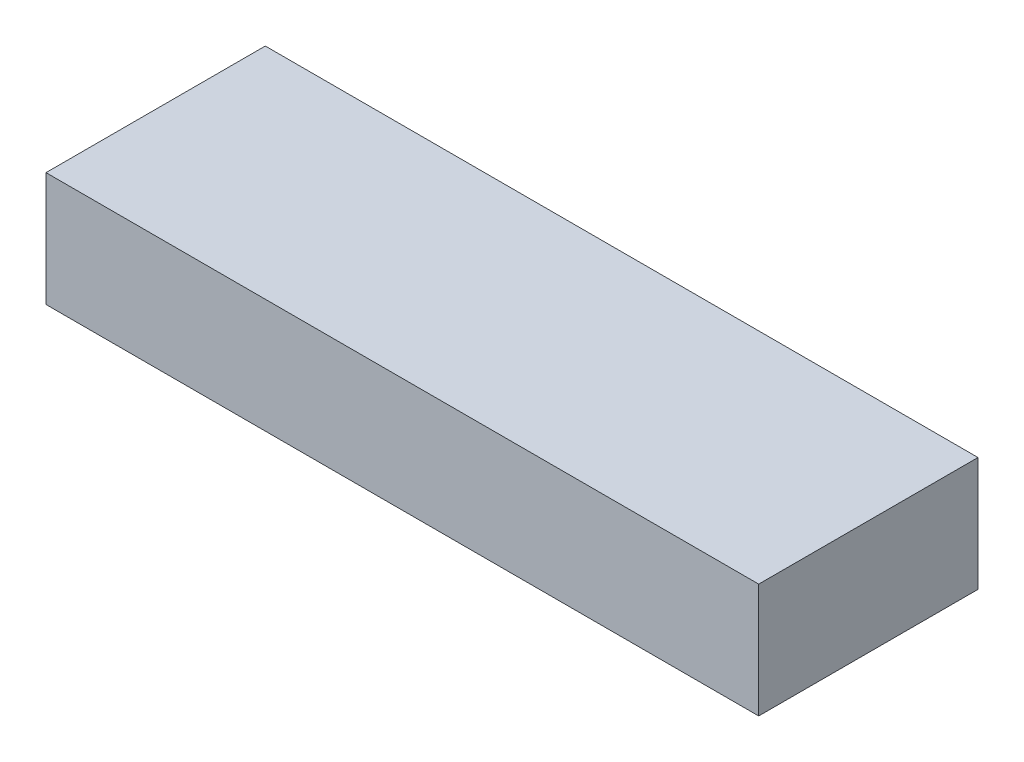
ISO-10303-21;
HEADER;
FILE_DESCRIPTION(('STEP AP214'),'2;1');
FILE_NAME('part.step','',(''),(''),'','','');
FILE_SCHEMA(('AUTOMOTIVE_DESIGN { 1 0 10303 214 1 1 1 1 }'));
ENDSEC;
DATA;
#1=APPLICATION_CONTEXT('core data for automotive mechanical design processes');
#2=APPLICATION_PROTOCOL_DEFINITION('international standard','automotive_design',2000,#1);
#3=PRODUCT_CONTEXT('',#1,'mechanical');
#4=PRODUCT('Part','Part','',(#3));
#5=PRODUCT_RELATED_PRODUCT_CATEGORY('part','',(#4));
#6=PRODUCT_DEFINITION_FORMATION('','',#4);
#7=PRODUCT_DEFINITION_CONTEXT('part definition',#1,'design');
#8=PRODUCT_DEFINITION('design','',#6,#7);
#9=PRODUCT_DEFINITION_SHAPE('','',#8);
#10=(LENGTH_UNIT() NAMED_UNIT(*) SI_UNIT(.MILLI.,.METRE.));
#11=(NAMED_UNIT(*) PLANE_ANGLE_UNIT() SI_UNIT($,.RADIAN.));
#12=(NAMED_UNIT(*) SI_UNIT($,.STERADIAN.) SOLID_ANGLE_UNIT());
#13=UNCERTAINTY_MEASURE_WITH_UNIT(LENGTH_MEASURE(1.E-05),#10,'distance_accuracy_value','');
#14=(GEOMETRIC_REPRESENTATION_CONTEXT(3) GLOBAL_UNCERTAINTY_ASSIGNED_CONTEXT((#13)) GLOBAL_UNIT_ASSIGNED_CONTEXT((#10,
#11,#12)) REPRESENTATION_CONTEXT('',''));
#15=CARTESIAN_POINT('',(0.,0.,0.));
#16=DIRECTION('',(0.,0.,1.));
#17=DIRECTION('',(1.,0.,0.));
#18=AXIS2_PLACEMENT_3D('',#15,#16,#17);
#19=CARTESIAN_POINT('',(78.,25.,-24.));
#20=DIRECTION('',(-1.,0.,0.));
#21=DIRECTION('',(0.,0.,1.));
#22=AXIS2_PLACEMENT_3D('',#19,#20,#21);
#23=PLANE('',#22);
#24=DIRECTION('',(0.,0.,-1.));
#25=VECTOR('',#24,1.);
#26=CARTESIAN_POINT('',(78.,0.,-24.));
#27=LINE('',#26,#25);
#28=CARTESIAN_POINT('',(78.,0.,24.));
#29=VERTEX_POINT('',#28);
#30=CARTESIAN_POINT('',(78.,0.,-24.));
#31=VERTEX_POINT('',#30);
#32=EDGE_CURVE('E105',#29,#31,#27,.T.);
#33=ORIENTED_EDGE('',*,*,#32,.T.);
#34=DIRECTION('',(0.,-1.,0.));
#35=VECTOR('',#34,1.);
#36=CARTESIAN_POINT('',(78.,25.,-24.));
#37=LINE('',#36,#35);
#38=CARTESIAN_POINT('',(78.,25.,-24.));
#39=VERTEX_POINT('',#38);
#40=EDGE_CURVE('E11',#39,#31,#37,.T.);
#41=ORIENTED_EDGE('',*,*,#40,.F.);
#42=DIRECTION('',(0.,0.,-1.));
#43=VECTOR('',#42,1.);
#44=CARTESIAN_POINT('',(78.,25.,-24.));
#45=LINE('',#44,#43);
#46=CARTESIAN_POINT('',(78.,25.,24.));
#47=VERTEX_POINT('',#46);
#48=EDGE_CURVE('E89',#47,#39,#45,.T.);
#49=ORIENTED_EDGE('',*,*,#48,.F.);
#50=DIRECTION('',(0.,-1.,0.));
#51=VECTOR('',#50,1.);
#52=CARTESIAN_POINT('',(78.,25.,24.));
#53=LINE('',#52,#51);
#54=EDGE_CURVE('E97',#47,#29,#53,.T.);
#55=ORIENTED_EDGE('',*,*,#54,.T.);
#56=EDGE_LOOP('',(#33,#41,#49,#55));
#57=FACE_BOUND('',#56,.T.);
#58=ADVANCED_FACE('F39',(#57),#23,.F.);
#59=CARTESIAN_POINT('',(-78.,25.,-24.));
#60=DIRECTION('',(0.,0.,1.));
#61=DIRECTION('',(1.,0.,0.));
#62=AXIS2_PLACEMENT_3D('',#59,#60,#61);
#63=PLANE('',#62);
#64=DIRECTION('',(-1.,0.,0.));
#65=VECTOR('',#64,1.);
#66=CARTESIAN_POINT('',(-78.,0.,-24.));
#67=LINE('',#66,#65);
#68=CARTESIAN_POINT('',(-78.,0.,-24.));
#69=VERTEX_POINT('',#68);
#70=EDGE_CURVE('E92',#31,#69,#67,.T.);
#71=ORIENTED_EDGE('',*,*,#70,.T.);
#72=DIRECTION('',(0.,-1.,0.));
#73=VECTOR('',#72,1.);
#74=CARTESIAN_POINT('',(-78.,25.,-24.));
#75=LINE('',#74,#73);
#76=CARTESIAN_POINT('',(-78.,25.,-24.));
#77=VERTEX_POINT('',#76);
#78=EDGE_CURVE('E50',#77,#69,#75,.T.);
#79=ORIENTED_EDGE('',*,*,#78,.F.);
#80=DIRECTION('',(-1.,0.,0.));
#81=VECTOR('',#80,1.);
#82=CARTESIAN_POINT('',(-78.,25.,-24.));
#83=LINE('',#82,#81);
#84=EDGE_CURVE('E82',#39,#77,#83,.T.);
#85=ORIENTED_EDGE('',*,*,#84,.F.);
#86=ORIENTED_EDGE('',*,*,#40,.T.);
#87=EDGE_LOOP('',(#71,#79,#85,#86));
#88=FACE_BOUND('',#87,.T.);
#89=ADVANCED_FACE('F93',(#88),#63,.F.);
#90=CARTESIAN_POINT('',(-78.,25.,-24.));
#91=DIRECTION('',(1.,0.,0.));
#92=DIRECTION('',(0.,0.,-1.));
#93=AXIS2_PLACEMENT_3D('',#90,#91,#92);
#94=PLANE('',#93);
#95=DIRECTION('',(0.,0.,1.));
#96=VECTOR('',#95,1.);
#97=CARTESIAN_POINT('',(-78.,0.,-24.));
#98=LINE('',#97,#96);
#99=CARTESIAN_POINT('',(-78.,0.,24.));
#100=VERTEX_POINT('',#99);
#101=EDGE_CURVE('E75',#69,#100,#98,.T.);
#102=ORIENTED_EDGE('',*,*,#101,.T.);
#103=DIRECTION('',(0.,-1.,0.));
#104=VECTOR('',#103,1.);
#105=CARTESIAN_POINT('',(-78.,25.,24.));
#106=LINE('',#105,#104);
#107=CARTESIAN_POINT('',(-78.,25.,24.));
#108=VERTEX_POINT('',#107);
#109=EDGE_CURVE('E94',#108,#100,#106,.T.);
#110=ORIENTED_EDGE('',*,*,#109,.F.);
#111=DIRECTION('',(0.,0.,1.));
#112=VECTOR('',#111,1.);
#113=CARTESIAN_POINT('',(-78.,25.,-24.));
#114=LINE('',#113,#112);
#115=EDGE_CURVE('E88',#77,#108,#114,.T.);
#116=ORIENTED_EDGE('',*,*,#115,.F.);
#117=ORIENTED_EDGE('',*,*,#78,.T.);
#118=EDGE_LOOP('',(#102,#110,#116,#117));
#119=FACE_BOUND('',#118,.T.);
#120=ADVANCED_FACE('F96',(#119),#94,.F.);
#121=CARTESIAN_POINT('',(-78.,25.,24.));
#122=DIRECTION('',(0.,0.,-1.));
#123=DIRECTION('',(-1.,0.,0.));
#124=AXIS2_PLACEMENT_3D('',#121,#122,#123);
#125=PLANE('',#124);
#126=DIRECTION('',(1.,0.,0.));
#127=VECTOR('',#126,1.);
#128=CARTESIAN_POINT('',(-78.,0.,24.));
#129=LINE('',#128,#127);
#130=EDGE_CURVE('E76',#100,#29,#129,.T.);
#131=ORIENTED_EDGE('',*,*,#130,.T.);
#132=ORIENTED_EDGE('',*,*,#54,.F.);
#133=DIRECTION('',(1.,0.,0.));
#134=VECTOR('',#133,1.);
#135=CARTESIAN_POINT('',(-78.,25.,24.));
#136=LINE('',#135,#134);
#137=EDGE_CURVE('E54',#108,#47,#136,.T.);
#138=ORIENTED_EDGE('',*,*,#137,.F.);
#139=ORIENTED_EDGE('',*,*,#109,.T.);
#140=EDGE_LOOP('',(#131,#132,#138,#139));
#141=FACE_BOUND('',#140,.T.);
#142=ADVANCED_FACE('F109',(#141),#125,.F.);
#143=CARTESIAN_POINT('',(0.,25.,0.));
#144=DIRECTION('',(0.,1.,0.));
#145=DIRECTION('',(0.,0.,1.));
#146=AXIS2_PLACEMENT_3D('',#143,#144,#145);
#147=PLANE('',#146);
#148=ORIENTED_EDGE('',*,*,#48,.T.);
#149=ORIENTED_EDGE('',*,*,#84,.T.);
#150=ORIENTED_EDGE('',*,*,#115,.T.);
#151=ORIENTED_EDGE('',*,*,#137,.T.);
#152=EDGE_LOOP('',(#148,#149,#150,#151));
#153=FACE_BOUND('',#152,.T.);
#154=ADVANCED_FACE('F86',(#153),#147,.T.);
#155=CARTESIAN_POINT('',(0.,0.,0.));
#156=DIRECTION('',(0.,1.,0.));
#157=DIRECTION('',(0.,0.,1.));
#158=AXIS2_PLACEMENT_3D('',#155,#156,#157);
#159=PLANE('',#158);
#160=ORIENTED_EDGE('',*,*,#32,.F.);
#161=ORIENTED_EDGE('',*,*,#130,.F.);
#162=ORIENTED_EDGE('',*,*,#101,.F.);
#163=ORIENTED_EDGE('',*,*,#70,.F.);
#164=EDGE_LOOP('',(#160,#161,#162,#163));
#165=FACE_BOUND('',#164,.T.);
#166=ADVANCED_FACE('F115',(#165),#159,.F.);
#167=CLOSED_SHELL('',(#58,#89,#120,#142,#154,#166));
#168=MANIFOLD_SOLID_BREP('B2',#167);
#169=ADVANCED_BREP_SHAPE_REPRESENTATION('',(#18,#168),#14);
#170=SHAPE_DEFINITION_REPRESENTATION(#9,#169);
ENDSEC;
END-ISO-10303-21;
